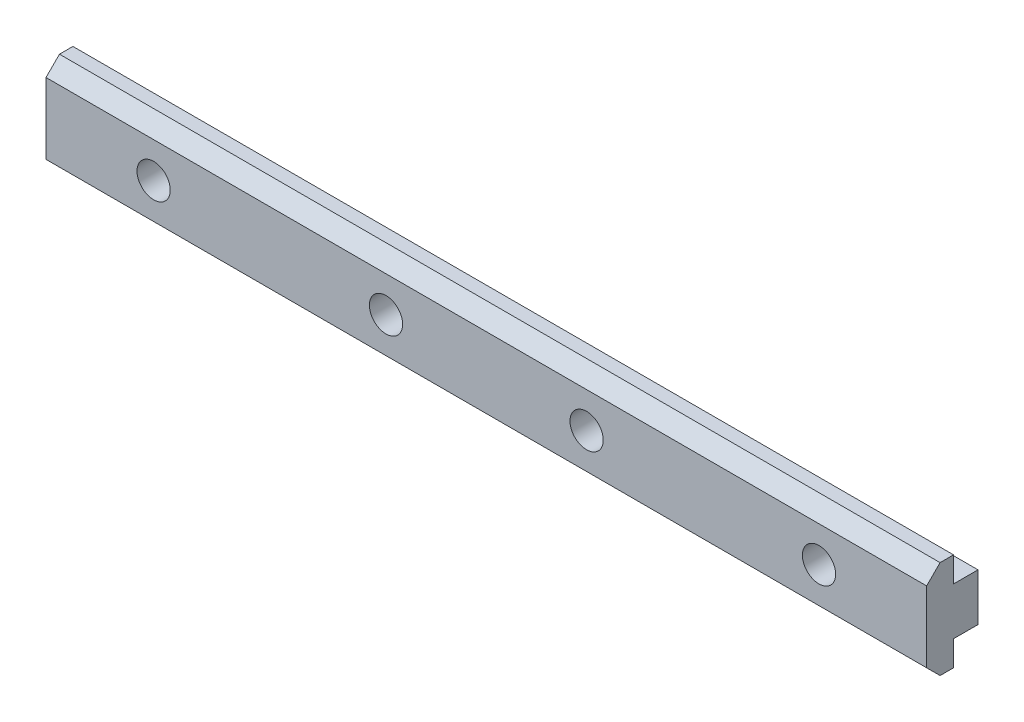
ISO-10303-21;
HEADER;
FILE_DESCRIPTION(('STEP AP214'),'2;1');
FILE_NAME('part.step','',(''),(''),'','','');
FILE_SCHEMA(('AUTOMOTIVE_DESIGN { 1 0 10303 214 1 1 1 1 }'));
ENDSEC;
DATA;
#1=APPLICATION_CONTEXT('core data for automotive mechanical design processes');
#2=APPLICATION_PROTOCOL_DEFINITION('international standard','automotive_design',2000,#1);
#3=PRODUCT_CONTEXT('',#1,'mechanical');
#4=PRODUCT('Part','Part','',(#3));
#5=PRODUCT_RELATED_PRODUCT_CATEGORY('part','',(#4));
#6=PRODUCT_DEFINITION_FORMATION('','',#4);
#7=PRODUCT_DEFINITION_CONTEXT('part definition',#1,'design');
#8=PRODUCT_DEFINITION('design','',#6,#7);
#9=PRODUCT_DEFINITION_SHAPE('','',#8);
#10=(LENGTH_UNIT() NAMED_UNIT(*) SI_UNIT(.MILLI.,.METRE.));
#11=(NAMED_UNIT(*) PLANE_ANGLE_UNIT() SI_UNIT($,.RADIAN.));
#12=(NAMED_UNIT(*) SI_UNIT($,.STERADIAN.) SOLID_ANGLE_UNIT());
#13=UNCERTAINTY_MEASURE_WITH_UNIT(LENGTH_MEASURE(1.E-05),#10,'distance_accuracy_value','');
#14=(GEOMETRIC_REPRESENTATION_CONTEXT(3) GLOBAL_UNCERTAINTY_ASSIGNED_CONTEXT((#13)) GLOBAL_UNIT_ASSIGNED_CONTEXT((#10,
#11,#12)) REPRESENTATION_CONTEXT('',''));
#15=CARTESIAN_POINT('',(0.,0.,0.));
#16=DIRECTION('',(0.,0.,1.));
#17=DIRECTION('',(1.,0.,0.));
#18=AXIS2_PLACEMENT_3D('',#15,#16,#17);
#19=CARTESIAN_POINT('',(90.,-5.15000000000009,7.75));
#20=DIRECTION('',(0.,0.707106781186518,-0.707106781186577));
#21=DIRECTION('',(0.,0.707106781186577,0.707106781186518));
#22=AXIS2_PLACEMENT_3D('',#19,#20,#21);
#23=PLANE('',#22);
#24=DIRECTION('',(0.,-0.707106781186577,-0.707106781186518));
#25=VECTOR('',#24,1.);
#26=CARTESIAN_POINT('',(-90.,-5.15000000000009,7.75));
#27=LINE('',#26,#25);
#28=CARTESIAN_POINT('',(-90.,-2.39999999999986,10.5));
#29=VERTEX_POINT('',#28);
#30=CARTESIAN_POINT('',(-90.,-5.15000000000009,7.75));
#31=VERTEX_POINT('',#30);
#32=EDGE_CURVE('E146',#29,#31,#27,.T.);
#33=ORIENTED_EDGE('',*,*,#32,.T.);
#34=DIRECTION('',(-1.,0.,0.));
#35=VECTOR('',#34,1.);
#36=CARTESIAN_POINT('',(90.,-5.15000000000009,7.75));
#37=LINE('',#36,#35);
#38=CARTESIAN_POINT('',(90.,-5.15000000000009,7.75));
#39=VERTEX_POINT('',#38);
#40=EDGE_CURVE('E11',#39,#31,#37,.T.);
#41=ORIENTED_EDGE('',*,*,#40,.F.);
#42=DIRECTION('',(0.,-0.707106781186577,-0.707106781186518));
#43=VECTOR('',#42,1.);
#44=CARTESIAN_POINT('',(90.,-5.15000000000009,7.75));
#45=LINE('',#44,#43);
#46=CARTESIAN_POINT('',(90.,-2.39999999999986,10.5));
#47=VERTEX_POINT('',#46);
#48=EDGE_CURVE('E165',#47,#39,#45,.T.);
#49=ORIENTED_EDGE('',*,*,#48,.F.);
#50=DIRECTION('',(-1.,0.,0.));
#51=VECTOR('',#50,1.);
#52=CARTESIAN_POINT('',(90.,-2.39999999999986,10.5));
#53=LINE('',#52,#51);
#54=EDGE_CURVE('E142',#47,#29,#53,.T.);
#55=ORIENTED_EDGE('',*,*,#54,.T.);
#56=EDGE_LOOP('',(#33,#41,#49,#55));
#57=FACE_BOUND('',#56,.T.);
#58=ADVANCED_FACE('F37',(#57),#23,.F.);
#59=CARTESIAN_POINT('',(90.,-5.15000000000009,5.));
#60=DIRECTION('',(0.,1.,0.));
#61=DIRECTION('',(0.,0.,1.));
#62=AXIS2_PLACEMENT_3D('',#59,#60,#61);
#63=PLANE('',#62);
#64=DIRECTION('',(0.,0.,-1.));
#65=VECTOR('',#64,1.);
#66=CARTESIAN_POINT('',(-90.,-5.15000000000009,5.));
#67=LINE('',#66,#65);
#68=CARTESIAN_POINT('',(-90.,-5.15000000000009,5.));
#69=VERTEX_POINT('',#68);
#70=EDGE_CURVE('E149',#31,#69,#67,.T.);
#71=ORIENTED_EDGE('',*,*,#70,.T.);
#72=DIRECTION('',(-1.,0.,0.));
#73=VECTOR('',#72,1.);
#74=CARTESIAN_POINT('',(90.,-5.15000000000009,5.));
#75=LINE('',#74,#73);
#76=CARTESIAN_POINT('',(90.,-5.15000000000009,5.));
#77=VERTEX_POINT('',#76);
#78=EDGE_CURVE('E46',#77,#69,#75,.T.);
#79=ORIENTED_EDGE('',*,*,#78,.F.);
#80=DIRECTION('',(0.,0.,-1.));
#81=VECTOR('',#80,1.);
#82=CARTESIAN_POINT('',(90.,-5.15000000000009,5.));
#83=LINE('',#82,#81);
#84=EDGE_CURVE('E103',#39,#77,#83,.T.);
#85=ORIENTED_EDGE('',*,*,#84,.F.);
#86=ORIENTED_EDGE('',*,*,#40,.T.);
#87=EDGE_LOOP('',(#71,#79,#85,#86));
#88=FACE_BOUND('',#87,.T.);
#89=ADVANCED_FACE('F267',(#88),#63,.F.);
#90=CARTESIAN_POINT('',(90.,-5.15000000000009,5.));
#91=DIRECTION('',(0.,0.,1.));
#92=DIRECTION('',(1.,0.,0.));
#93=AXIS2_PLACEMENT_3D('',#90,#91,#92);
#94=PLANE('',#93);
#95=DIRECTION('',(0.,1.,0.));
#96=VECTOR('',#95,1.);
#97=CARTESIAN_POINT('',(-90.,-5.15000000000009,5.));
#98=LINE('',#97,#96);
#99=CARTESIAN_POINT('',(-90.,-2.27373675443232E-13,5.));
#100=VERTEX_POINT('',#99);
#101=EDGE_CURVE('E152',#69,#100,#98,.T.);
#102=ORIENTED_EDGE('',*,*,#101,.T.);
#103=DIRECTION('',(-1.,0.,0.));
#104=VECTOR('',#103,1.);
#105=CARTESIAN_POINT('',(90.,-2.27373675443232E-13,5.));
#106=LINE('',#105,#104);
#107=CARTESIAN_POINT('',(90.,-2.27373675443232E-13,5.));
#108=VERTEX_POINT('',#107);
#109=EDGE_CURVE('E178',#108,#100,#106,.T.);
#110=ORIENTED_EDGE('',*,*,#109,.F.);
#111=DIRECTION('',(0.,1.,0.));
#112=VECTOR('',#111,1.);
#113=CARTESIAN_POINT('',(90.,-5.15000000000009,5.));
#114=LINE('',#113,#112);
#115=EDGE_CURVE('E187',#77,#108,#114,.T.);
#116=ORIENTED_EDGE('',*,*,#115,.F.);
#117=ORIENTED_EDGE('',*,*,#78,.T.);
#118=EDGE_LOOP('',(#102,#110,#116,#117));
#119=FACE_BOUND('',#118,.T.);
#120=ADVANCED_FACE('F185',(#119),#94,.F.);
#121=CARTESIAN_POINT('',(90.,0.,0.));
#122=DIRECTION('',(0.,1.,0.));
#123=DIRECTION('',(0.,0.,1.));
#124=AXIS2_PLACEMENT_3D('',#121,#122,#123);
#125=PLANE('',#124);
#126=DIRECTION('',(0.,0.,-1.));
#127=VECTOR('',#126,1.);
#128=CARTESIAN_POINT('',(-90.,0.,0.));
#129=LINE('',#128,#127);
#130=CARTESIAN_POINT('',(-90.,0.,0.));
#131=VERTEX_POINT('',#130);
#132=EDGE_CURVE('E154',#100,#131,#129,.T.);
#133=ORIENTED_EDGE('',*,*,#132,.T.);
#134=DIRECTION('',(-1.,0.,0.));
#135=VECTOR('',#134,1.);
#136=CARTESIAN_POINT('',(90.,0.,0.));
#137=LINE('',#136,#135);
#138=CARTESIAN_POINT('',(90.,0.,0.));
#139=VERTEX_POINT('',#138);
#140=EDGE_CURVE('E175',#139,#131,#137,.T.);
#141=ORIENTED_EDGE('',*,*,#140,.F.);
#142=DIRECTION('',(0.,0.,-1.));
#143=VECTOR('',#142,1.);
#144=CARTESIAN_POINT('',(90.,0.,0.));
#145=LINE('',#144,#143);
#146=EDGE_CURVE('E205',#108,#139,#145,.T.);
#147=ORIENTED_EDGE('',*,*,#146,.F.);
#148=ORIENTED_EDGE('',*,*,#109,.T.);
#149=EDGE_LOOP('',(#133,#141,#147,#148));
#150=FACE_BOUND('',#149,.T.);
#151=ADVANCED_FACE('F196',(#150),#125,.F.);
#152=CARTESIAN_POINT('',(90.,0.,0.));
#153=DIRECTION('',(0.,0.,1.));
#154=DIRECTION('',(1.,0.,0.));
#155=AXIS2_PLACEMENT_3D('',#152,#153,#154);
#156=PLANE('',#155);
#157=CARTESIAN_POINT('',(68.,4.84999999999991,0.));
#158=DIRECTION('',(0.,0.,-1.));
#159=DIRECTION('',(-1.,0.,0.));
#160=AXIS2_PLACEMENT_3D('',#157,#158,#159);
#161=CIRCLE('',#160,3.4);
#162=CARTESIAN_POINT('',(64.6,4.84999999999991,0.));
#163=VERTEX_POINT('',#162);
#164=EDGE_CURVE('E230',#163,#163,#161,.T.);
#165=ORIENTED_EDGE('',*,*,#164,.F.);
#166=EDGE_LOOP('',(#165));
#167=FACE_BOUND('',#166,.T.);
#168=CARTESIAN_POINT('',(20.5,4.84999999999991,0.));
#169=DIRECTION('',(0.,0.,-1.));
#170=DIRECTION('',(-1.,0.,0.));
#171=AXIS2_PLACEMENT_3D('',#168,#169,#170);
#172=CIRCLE('',#171,3.4);
#173=CARTESIAN_POINT('',(17.1,4.84999999999991,0.));
#174=VERTEX_POINT('',#173);
#175=EDGE_CURVE('E224',#174,#174,#172,.T.);
#176=ORIENTED_EDGE('',*,*,#175,.F.);
#177=EDGE_LOOP('',(#176));
#178=FACE_BOUND('',#177,.T.);
#179=CARTESIAN_POINT('',(-20.4999999999999,4.84999999999991,0.));
#180=DIRECTION('',(0.,0.,-1.));
#181=DIRECTION('',(-1.,0.,0.));
#182=AXIS2_PLACEMENT_3D('',#179,#180,#181);
#183=CIRCLE('',#182,3.4);
#184=CARTESIAN_POINT('',(-23.8999999999999,4.84999999999991,0.));
#185=VERTEX_POINT('',#184);
#186=EDGE_CURVE('E221',#185,#185,#183,.T.);
#187=ORIENTED_EDGE('',*,*,#186,.F.);
#188=EDGE_LOOP('',(#187));
#189=FACE_BOUND('',#188,.T.);
#190=CARTESIAN_POINT('',(-67.9999999999999,4.84999999999991,0.));
#191=DIRECTION('',(0.,0.,-1.));
#192=DIRECTION('',(-1.,0.,0.));
#193=AXIS2_PLACEMENT_3D('',#190,#191,#192);
#194=CIRCLE('',#193,3.4);
#195=CARTESIAN_POINT('',(-71.3999999999999,4.84999999999991,0.));
#196=VERTEX_POINT('',#195);
#197=EDGE_CURVE('E215',#196,#196,#194,.T.);
#198=ORIENTED_EDGE('',*,*,#197,.F.);
#199=EDGE_LOOP('',(#198));
#200=FACE_BOUND('',#199,.T.);
#201=DIRECTION('',(0.,1.,0.));
#202=VECTOR('',#201,1.);
#203=CARTESIAN_POINT('',(-90.,0.,0.));
#204=LINE('',#203,#202);
#205=CARTESIAN_POINT('',(-90.,9.69999999999982,0.));
#206=VERTEX_POINT('',#205);
#207=EDGE_CURVE('E156',#131,#206,#204,.T.);
#208=ORIENTED_EDGE('',*,*,#207,.T.);
#209=DIRECTION('',(-1.,0.,0.));
#210=VECTOR('',#209,1.);
#211=CARTESIAN_POINT('',(90.,9.69999999999982,0.));
#212=LINE('',#211,#210);
#213=CARTESIAN_POINT('',(90.,9.69999999999982,0.));
#214=VERTEX_POINT('',#213);
#215=EDGE_CURVE('E172',#214,#206,#212,.T.);
#216=ORIENTED_EDGE('',*,*,#215,.F.);
#217=DIRECTION('',(0.,1.,0.));
#218=VECTOR('',#217,1.);
#219=CARTESIAN_POINT('',(90.,0.,0.));
#220=LINE('',#219,#218);
#221=EDGE_CURVE('E202',#139,#214,#220,.T.);
#222=ORIENTED_EDGE('',*,*,#221,.F.);
#223=ORIENTED_EDGE('',*,*,#140,.T.);
#224=EDGE_LOOP('',(#208,#216,#222,#223));
#225=FACE_BOUND('',#224,.T.);
#226=ADVANCED_FACE('F200',(#167,#178,#189,#200,#225),#156,.F.);
#227=CARTESIAN_POINT('',(90.,9.69999999999982,0.));
#228=DIRECTION('',(0.,-1.,0.));
#229=DIRECTION('',(0.,0.,-1.));
#230=AXIS2_PLACEMENT_3D('',#227,#228,#229);
#231=PLANE('',#230);
#232=DIRECTION('',(0.,0.,1.));
#233=VECTOR('',#232,1.);
#234=CARTESIAN_POINT('',(-90.,9.69999999999982,0.));
#235=LINE('',#234,#233);
#236=CARTESIAN_POINT('',(-90.,9.69999999999982,5.));
#237=VERTEX_POINT('',#236);
#238=EDGE_CURVE('E158',#206,#237,#235,.T.);
#239=ORIENTED_EDGE('',*,*,#238,.T.);
#240=DIRECTION('',(-1.,0.,0.));
#241=VECTOR('',#240,1.);
#242=CARTESIAN_POINT('',(90.,9.69999999999982,5.));
#243=LINE('',#242,#241);
#244=CARTESIAN_POINT('',(90.,9.69999999999982,5.));
#245=VERTEX_POINT('',#244);
#246=EDGE_CURVE('E169',#245,#237,#243,.T.);
#247=ORIENTED_EDGE('',*,*,#246,.F.);
#248=DIRECTION('',(0.,0.,1.));
#249=VECTOR('',#248,1.);
#250=CARTESIAN_POINT('',(90.,9.69999999999982,0.));
#251=LINE('',#250,#249);
#252=EDGE_CURVE('E204',#214,#245,#251,.T.);
#253=ORIENTED_EDGE('',*,*,#252,.F.);
#254=ORIENTED_EDGE('',*,*,#215,.T.);
#255=EDGE_LOOP('',(#239,#247,#253,#254));
#256=FACE_BOUND('',#255,.T.);
#257=ADVANCED_FACE('F239',(#256),#231,.F.);
#258=CARTESIAN_POINT('',(90.,9.69999999999982,5.));
#259=DIRECTION('',(0.,0.,1.));
#260=DIRECTION('',(1.,0.,0.));
#261=AXIS2_PLACEMENT_3D('',#258,#259,#260);
#262=PLANE('',#261);
#263=DIRECTION('',(0.,1.,0.));
#264=VECTOR('',#263,1.);
#265=CARTESIAN_POINT('',(-90.,9.69999999999982,5.));
#266=LINE('',#265,#264);
#267=CARTESIAN_POINT('',(-90.,14.8499999999999,5.));
#268=VERTEX_POINT('',#267);
#269=EDGE_CURVE('E160',#237,#268,#266,.T.);
#270=ORIENTED_EDGE('',*,*,#269,.T.);
#271=DIRECTION('',(-1.,0.,0.));
#272=VECTOR('',#271,1.);
#273=CARTESIAN_POINT('',(90.,14.8499999999999,5.));
#274=LINE('',#273,#272);
#275=CARTESIAN_POINT('',(90.,14.8499999999999,5.));
#276=VERTEX_POINT('',#275);
#277=EDGE_CURVE('E137',#276,#268,#274,.T.);
#278=ORIENTED_EDGE('',*,*,#277,.F.);
#279=DIRECTION('',(0.,1.,0.));
#280=VECTOR('',#279,1.);
#281=CARTESIAN_POINT('',(90.,9.69999999999982,5.));
#282=LINE('',#281,#280);
#283=EDGE_CURVE('E128',#245,#276,#282,.T.);
#284=ORIENTED_EDGE('',*,*,#283,.F.);
#285=ORIENTED_EDGE('',*,*,#246,.T.);
#286=EDGE_LOOP('',(#270,#278,#284,#285));
#287=FACE_BOUND('',#286,.T.);
#288=ADVANCED_FACE('F276',(#287),#262,.F.);
#289=CARTESIAN_POINT('',(90.,14.8499999999999,5.));
#290=DIRECTION('',(0.,-1.,0.));
#291=DIRECTION('',(0.,0.,-1.));
#292=AXIS2_PLACEMENT_3D('',#289,#290,#291);
#293=PLANE('',#292);
#294=DIRECTION('',(0.,0.,1.));
#295=VECTOR('',#294,1.);
#296=CARTESIAN_POINT('',(-90.,14.8499999999999,5.));
#297=LINE('',#296,#295);
#298=CARTESIAN_POINT('',(-90.,14.8499999999999,7.75));
#299=VERTEX_POINT('',#298);
#300=EDGE_CURVE('E136',#268,#299,#297,.T.);
#301=ORIENTED_EDGE('',*,*,#300,.T.);
#302=DIRECTION('',(-1.,0.,0.));
#303=VECTOR('',#302,1.);
#304=CARTESIAN_POINT('',(90.,14.8499999999999,7.75));
#305=LINE('',#304,#303);
#306=CARTESIAN_POINT('',(90.,14.8499999999999,7.75));
#307=VERTEX_POINT('',#306);
#308=EDGE_CURVE('E133',#307,#299,#305,.T.);
#309=ORIENTED_EDGE('',*,*,#308,.F.);
#310=DIRECTION('',(0.,0.,1.));
#311=VECTOR('',#310,1.);
#312=CARTESIAN_POINT('',(90.,14.8499999999999,5.));
#313=LINE('',#312,#311);
#314=EDGE_CURVE('E122',#276,#307,#313,.T.);
#315=ORIENTED_EDGE('',*,*,#314,.F.);
#316=ORIENTED_EDGE('',*,*,#277,.T.);
#317=EDGE_LOOP('',(#301,#309,#315,#316));
#318=FACE_BOUND('',#317,.T.);
#319=ADVANCED_FACE('F134',(#318),#293,.F.);
#320=CARTESIAN_POINT('',(90.,14.8499999999999,7.75));
#321=DIRECTION('',(0.,-0.707106781186577,-0.707106781186518));
#322=DIRECTION('',(0.,0.707106781186518,-0.707106781186577));
#323=AXIS2_PLACEMENT_3D('',#320,#321,#322);
#324=PLANE('',#323);
#325=DIRECTION('',(0.,-0.707106781186518,0.707106781186577));
#326=VECTOR('',#325,1.);
#327=CARTESIAN_POINT('',(-90.,14.8499999999999,7.75));
#328=LINE('',#327,#326);
#329=CARTESIAN_POINT('',(-90.,12.1000000000001,10.5));
#330=VERTEX_POINT('',#329);
#331=EDGE_CURVE('E89',#299,#330,#328,.T.);
#332=ORIENTED_EDGE('',*,*,#331,.T.);
#333=DIRECTION('',(-1.,0.,0.));
#334=VECTOR('',#333,1.);
#335=CARTESIAN_POINT('',(90.,12.1000000000001,10.5));
#336=LINE('',#335,#334);
#337=CARTESIAN_POINT('',(90.,12.1000000000001,10.5));
#338=VERTEX_POINT('',#337);
#339=EDGE_CURVE('E138',#338,#330,#336,.T.);
#340=ORIENTED_EDGE('',*,*,#339,.F.);
#341=DIRECTION('',(0.,-0.707106781186518,0.707106781186577));
#342=VECTOR('',#341,1.);
#343=CARTESIAN_POINT('',(90.,14.8499999999999,7.75));
#344=LINE('',#343,#342);
#345=EDGE_CURVE('E126',#307,#338,#344,.T.);
#346=ORIENTED_EDGE('',*,*,#345,.F.);
#347=ORIENTED_EDGE('',*,*,#308,.T.);
#348=EDGE_LOOP('',(#332,#340,#346,#347));
#349=FACE_BOUND('',#348,.T.);
#350=ADVANCED_FACE('F140',(#349),#324,.F.);
#351=CARTESIAN_POINT('',(90.,-2.39999999999986,10.5));
#352=DIRECTION('',(0.,0.,-1.));
#353=DIRECTION('',(-1.,0.,0.));
#354=AXIS2_PLACEMENT_3D('',#351,#352,#353);
#355=PLANE('',#354);
#356=CARTESIAN_POINT('',(68.,4.84999999999991,10.5));
#357=DIRECTION('',(0.,0.,-1.));
#358=DIRECTION('',(-1.,0.,0.));
#359=AXIS2_PLACEMENT_3D('',#356,#357,#358);
#360=CIRCLE('',#359,3.39999999999999);
#361=CARTESIAN_POINT('',(64.6,4.84999999999991,10.5));
#362=VERTEX_POINT('',#361);
#363=EDGE_CURVE('E227',#362,#362,#360,.T.);
#364=ORIENTED_EDGE('',*,*,#363,.T.);
#365=EDGE_LOOP('',(#364));
#366=FACE_BOUND('',#365,.T.);
#367=CARTESIAN_POINT('',(20.5,4.84999999999991,10.5));
#368=DIRECTION('',(0.,0.,-1.));
#369=DIRECTION('',(-1.,0.,0.));
#370=AXIS2_PLACEMENT_3D('',#367,#368,#369);
#371=CIRCLE('',#370,3.4);
#372=CARTESIAN_POINT('',(17.1,4.84999999999991,10.5));
#373=VERTEX_POINT('',#372);
#374=EDGE_CURVE('E40',#373,#373,#371,.T.);
#375=ORIENTED_EDGE('',*,*,#374,.T.);
#376=EDGE_LOOP('',(#375));
#377=FACE_BOUND('',#376,.T.);
#378=CARTESIAN_POINT('',(-20.4999999999999,4.84999999999991,10.5));
#379=DIRECTION('',(0.,0.,-1.));
#380=DIRECTION('',(-1.,0.,0.));
#381=AXIS2_PLACEMENT_3D('',#378,#379,#380);
#382=CIRCLE('',#381,3.4);
#383=CARTESIAN_POINT('',(-23.8999999999999,4.84999999999991,10.5));
#384=VERTEX_POINT('',#383);
#385=EDGE_CURVE('E218',#384,#384,#382,.T.);
#386=ORIENTED_EDGE('',*,*,#385,.T.);
#387=EDGE_LOOP('',(#386));
#388=FACE_BOUND('',#387,.T.);
#389=CARTESIAN_POINT('',(-67.9999999999999,4.84999999999991,10.5));
#390=DIRECTION('',(0.,0.,-1.));
#391=DIRECTION('',(-1.,0.,0.));
#392=AXIS2_PLACEMENT_3D('',#389,#390,#391);
#393=CIRCLE('',#392,3.39999999999999);
#394=CARTESIAN_POINT('',(-71.3999999999999,4.84999999999991,10.5));
#395=VERTEX_POINT('',#394);
#396=EDGE_CURVE('E150',#395,#395,#393,.T.);
#397=ORIENTED_EDGE('',*,*,#396,.T.);
#398=EDGE_LOOP('',(#397));
#399=FACE_BOUND('',#398,.T.);
#400=DIRECTION('',(0.,-1.,0.));
#401=VECTOR('',#400,1.);
#402=CARTESIAN_POINT('',(-90.,-2.39999999999986,10.5));
#403=LINE('',#402,#401);
#404=EDGE_CURVE('E95',#330,#29,#403,.T.);
#405=ORIENTED_EDGE('',*,*,#404,.T.);
#406=ORIENTED_EDGE('',*,*,#54,.F.);
#407=DIRECTION('',(0.,-1.,0.));
#408=VECTOR('',#407,1.);
#409=CARTESIAN_POINT('',(90.,-2.39999999999986,10.5));
#410=LINE('',#409,#408);
#411=EDGE_CURVE('E54',#338,#47,#410,.T.);
#412=ORIENTED_EDGE('',*,*,#411,.F.);
#413=ORIENTED_EDGE('',*,*,#339,.T.);
#414=EDGE_LOOP('',(#405,#406,#412,#413));
#415=FACE_BOUND('',#414,.T.);
#416=ADVANCED_FACE('F254',(#366,#377,#388,#399,#415),#355,.F.);
#417=CARTESIAN_POINT('',(90.,0.,0.));
#418=DIRECTION('',(1.,0.,0.));
#419=DIRECTION('',(0.,0.,-1.));
#420=AXIS2_PLACEMENT_3D('',#417,#418,#419);
#421=PLANE('',#420);
#422=ORIENTED_EDGE('',*,*,#48,.T.);
#423=ORIENTED_EDGE('',*,*,#84,.T.);
#424=ORIENTED_EDGE('',*,*,#115,.T.);
#425=ORIENTED_EDGE('',*,*,#146,.T.);
#426=ORIENTED_EDGE('',*,*,#221,.T.);
#427=ORIENTED_EDGE('',*,*,#252,.T.);
#428=ORIENTED_EDGE('',*,*,#283,.T.);
#429=ORIENTED_EDGE('',*,*,#314,.T.);
#430=ORIENTED_EDGE('',*,*,#345,.T.);
#431=ORIENTED_EDGE('',*,*,#411,.T.);
#432=EDGE_LOOP('',(#422,#423,#424,#425,#426,#427,#428,#429,#430,#431));
#433=FACE_BOUND('',#432,.T.);
#434=ADVANCED_FACE('F124',(#433),#421,.T.);
#435=CARTESIAN_POINT('',(-90.,0.,0.));
#436=DIRECTION('',(1.,0.,0.));
#437=DIRECTION('',(0.,0.,-1.));
#438=AXIS2_PLACEMENT_3D('',#435,#436,#437);
#439=PLANE('',#438);
#440=ORIENTED_EDGE('',*,*,#32,.F.);
#441=ORIENTED_EDGE('',*,*,#404,.F.);
#442=ORIENTED_EDGE('',*,*,#331,.F.);
#443=ORIENTED_EDGE('',*,*,#300,.F.);
#444=ORIENTED_EDGE('',*,*,#269,.F.);
#445=ORIENTED_EDGE('',*,*,#238,.F.);
#446=ORIENTED_EDGE('',*,*,#207,.F.);
#447=ORIENTED_EDGE('',*,*,#132,.F.);
#448=ORIENTED_EDGE('',*,*,#101,.F.);
#449=ORIENTED_EDGE('',*,*,#70,.F.);
#450=EDGE_LOOP('',(#440,#441,#442,#443,#444,#445,#446,#447,#448,#449));
#451=FACE_BOUND('',#450,.T.);
#452=ADVANCED_FACE('F191',(#451),#439,.F.);
#453=CARTESIAN_POINT('',(-67.9999999999999,4.84999999999991,0.));
#454=DIRECTION('',(0.,0.,-1.));
#455=DIRECTION('',(-1.,0.,0.));
#456=AXIS2_PLACEMENT_3D('',#453,#454,#455);
#457=CYLINDRICAL_SURFACE('',#456,3.39999999999999);
#458=ORIENTED_EDGE('',*,*,#197,.T.);
#459=EDGE_LOOP('',(#458));
#460=FACE_BOUND('',#459,.T.);
#461=ORIENTED_EDGE('',*,*,#396,.F.);
#462=EDGE_LOOP('',(#461));
#463=FACE_BOUND('',#462,.T.);
#464=ADVANCED_FACE('F247',(#460,#463),#457,.F.);
#465=CARTESIAN_POINT('',(-20.4999999999999,4.84999999999991,0.));
#466=DIRECTION('',(0.,0.,-1.));
#467=DIRECTION('',(-1.,0.,0.));
#468=AXIS2_PLACEMENT_3D('',#465,#466,#467);
#469=CYLINDRICAL_SURFACE('',#468,3.4);
#470=ORIENTED_EDGE('',*,*,#186,.T.);
#471=EDGE_LOOP('',(#470));
#472=FACE_BOUND('',#471,.T.);
#473=ORIENTED_EDGE('',*,*,#385,.F.);
#474=EDGE_LOOP('',(#473));
#475=FACE_BOUND('',#474,.T.);
#476=ADVANCED_FACE('F250',(#472,#475),#469,.F.);
#477=CARTESIAN_POINT('',(20.5,4.84999999999991,0.));
#478=DIRECTION('',(0.,0.,-1.));
#479=DIRECTION('',(-1.,0.,0.));
#480=AXIS2_PLACEMENT_3D('',#477,#478,#479);
#481=CYLINDRICAL_SURFACE('',#480,3.4);
#482=ORIENTED_EDGE('',*,*,#175,.T.);
#483=EDGE_LOOP('',(#482));
#484=FACE_BOUND('',#483,.T.);
#485=ORIENTED_EDGE('',*,*,#374,.F.);
#486=EDGE_LOOP('',(#485));
#487=FACE_BOUND('',#486,.T.);
#488=ADVANCED_FACE('F331',(#484,#487),#481,.F.);
#489=CARTESIAN_POINT('',(68.,4.84999999999991,0.));
#490=DIRECTION('',(0.,0.,-1.));
#491=DIRECTION('',(-1.,0.,0.));
#492=AXIS2_PLACEMENT_3D('',#489,#490,#491);
#493=CYLINDRICAL_SURFACE('',#492,3.39999999999999);
#494=ORIENTED_EDGE('',*,*,#164,.T.);
#495=EDGE_LOOP('',(#494));
#496=FACE_BOUND('',#495,.T.);
#497=ORIENTED_EDGE('',*,*,#363,.F.);
#498=EDGE_LOOP('',(#497));
#499=FACE_BOUND('',#498,.T.);
#500=ADVANCED_FACE('F234',(#496,#499),#493,.F.);
#501=CLOSED_SHELL('',(#58,#89,#120,#151,#226,#257,#288,#319,#350,#416,#434,#452,#464,#476,#488,#500));
#502=MANIFOLD_SOLID_BREP('B2',#501);
#503=ADVANCED_BREP_SHAPE_REPRESENTATION('',(#18,#502),#14);
#504=SHAPE_DEFINITION_REPRESENTATION(#9,#503);
ENDSEC;
END-ISO-10303-21;
